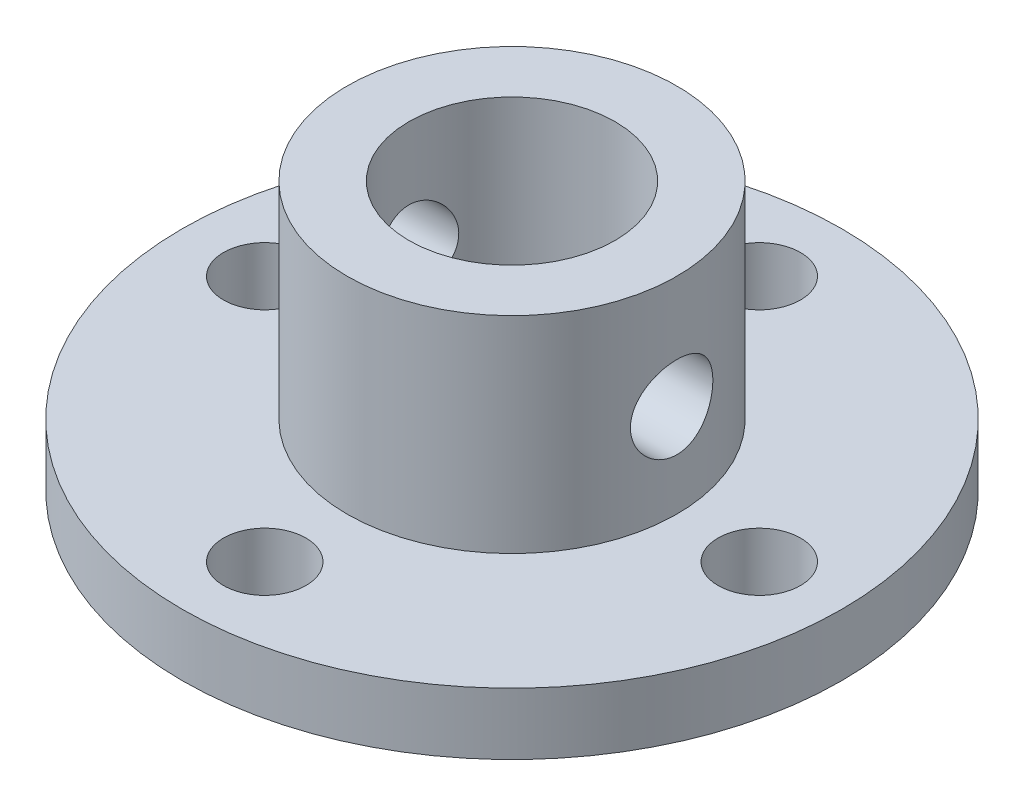
ISO-10303-21;
HEADER;
FILE_DESCRIPTION(('STEP AP214'),'2;1');
FILE_NAME('part.step','',(''),(''),'','','');
FILE_SCHEMA(('AUTOMOTIVE_DESIGN { 1 0 10303 214 1 1 1 1 }'));
ENDSEC;
DATA;
#1=APPLICATION_CONTEXT('core data for automotive mechanical design processes');
#2=APPLICATION_PROTOCOL_DEFINITION('international standard','automotive_design',2000,#1);
#3=PRODUCT_CONTEXT('',#1,'mechanical');
#4=PRODUCT('Part','Part','',(#3));
#5=PRODUCT_RELATED_PRODUCT_CATEGORY('part','',(#4));
#6=PRODUCT_DEFINITION_FORMATION('','',#4);
#7=PRODUCT_DEFINITION_CONTEXT('part definition',#1,'design');
#8=PRODUCT_DEFINITION('design','',#6,#7);
#9=PRODUCT_DEFINITION_SHAPE('','',#8);
#10=(LENGTH_UNIT() NAMED_UNIT(*) SI_UNIT(.MILLI.,.METRE.));
#11=(NAMED_UNIT(*) PLANE_ANGLE_UNIT() SI_UNIT($,.RADIAN.));
#12=(NAMED_UNIT(*) SI_UNIT($,.STERADIAN.) SOLID_ANGLE_UNIT());
#13=UNCERTAINTY_MEASURE_WITH_UNIT(LENGTH_MEASURE(1.E-05),#10,'distance_accuracy_value','');
#14=(GEOMETRIC_REPRESENTATION_CONTEXT(3) GLOBAL_UNCERTAINTY_ASSIGNED_CONTEXT((#13)) GLOBAL_UNIT_ASSIGNED_CONTEXT((#10,
#11,#12)) REPRESENTATION_CONTEXT('',''));
#15=CARTESIAN_POINT('',(0.,0.,0.));
#16=DIRECTION('',(0.,0.,1.));
#17=DIRECTION('',(1.,0.,0.));
#18=AXIS2_PLACEMENT_3D('',#15,#16,#17);
#19=CARTESIAN_POINT('',(0.,3.,0.));
#20=DIRECTION('',(0.,-1.,0.));
#21=DIRECTION('',(0.,0.,-1.));
#22=AXIS2_PLACEMENT_3D('',#19,#20,#21);
#23=CYLINDRICAL_SURFACE('',#22,5.);
#24=CARTESIAN_POINT('',(-4.58257569495584,7.5,2.));
#25=CARTESIAN_POINT('',(-4.58258022779737,7.60712368971296,1.99999540068022));
#26=CARTESIAN_POINT('',(-4.58638433797122,7.71442629433184,1.99134173553407));
#27=CARTESIAN_POINT('',(-4.601110833066,7.92593908409957,1.95706710874823));
#28=CARTESIAN_POINT('',(-4.61205140628347,8.03014065433852,1.93140279032341));
#29=CARTESIAN_POINT('',(-4.63960410719222,8.23205180897082,1.86423554476216));
#30=CARTESIAN_POINT('',(-4.65619484260882,8.32978424329122,1.82279228998551));
#31=CARTESIAN_POINT('',(-4.69314677188873,8.5168853548623,1.72542013194152));
#32=CARTESIAN_POINT('',(-4.71350714220611,8.60625585252411,1.66949439157707));
#33=CARTESIAN_POINT('',(-4.75700861562336,8.77926031454433,1.54132201423254));
#34=CARTESIAN_POINT('',(-4.78023917022606,8.86235639939724,1.46837936836551));
#35=CARTESIAN_POINT('',(-4.82612457915278,9.0155290208558,1.30970909513215));
#36=CARTESIAN_POINT('',(-4.84877922991761,9.08560100770971,1.22397701877347));
#37=CARTESIAN_POINT('',(-4.89203407641395,9.21340639030971,1.03800631337303));
#38=CARTESIAN_POINT('',(-4.9125180361257,9.27054429968594,0.937328966419093));
#39=CARTESIAN_POINT('',(-4.94803927702516,9.36684357017379,0.726825322068638));
#40=CARTESIAN_POINT('',(-4.96307877403249,9.40601224624887,0.617002769076883));
#41=CARTESIAN_POINT('',(-4.98538324990609,9.46334148599309,0.396966427039754));
#42=CARTESIAN_POINT('',(-4.99298936770628,9.48242731397022,0.287028984858317));
#43=CARTESIAN_POINT('',(-5.00080310687431,9.50202848578145,0.0652663285839626));
#44=CARTESIAN_POINT('',(-5.00101348770556,9.5025507559658,-0.0465581658394104));
#45=CARTESIAN_POINT('',(-4.99421962820612,9.4855172301958,-0.262232494702088));
#46=CARTESIAN_POINT('',(-4.98761996771485,9.46897522724528,-0.366177452870456));
#47=CARTESIAN_POINT('',(-4.96849291469141,9.42000712369703,-0.569673109221913));
#48=CARTESIAN_POINT('',(-4.95596508721342,9.38757985760154,-0.669223484391238));
#49=CARTESIAN_POINT('',(-4.92596824457467,9.30736351712174,-0.862897938510557));
#50=CARTESIAN_POINT('',(-4.90842760466223,9.25935028518462,-0.956917623378894));
#51=CARTESIAN_POINT('',(-4.87014585180275,9.14953499308084,-1.13580815074131));
#52=CARTESIAN_POINT('',(-4.84940364267149,9.08772820689983,-1.22067584271796));
#53=CARTESIAN_POINT('',(-4.80521637176122,8.94735086405612,-1.38476882799017));
#54=CARTESIAN_POINT('',(-4.78168326511759,8.8679461074272,-1.46325784526632));
#55=CARTESIAN_POINT('',(-4.73561660973263,8.697009428168,-1.60610741539265));
#56=CARTESIAN_POINT('',(-4.71308339008076,8.6054735518044,-1.67046334378698));
#57=CARTESIAN_POINT('',(-4.67096897409023,8.40958097762606,-1.78490418871927));
#58=CARTESIAN_POINT('',(-4.65148914057708,8.30493516966135,-1.83453465163626));
#59=CARTESIAN_POINT('',(-4.61887590344084,8.08778450968778,-1.91517625986646));
#60=CARTESIAN_POINT('',(-4.60573837891311,7.97528481527341,-1.94619949837798));
#61=CARTESIAN_POINT('',(-4.58829759702716,7.75296422253256,-1.9869549488549));
#62=CARTESIAN_POINT('',(-4.58350366456138,7.64339955287144,-1.99787209681454));
#63=CARTESIAN_POINT('',(-4.58189497869038,7.42392279224044,-2.00156132644289));
#64=CARTESIAN_POINT('',(-4.58507780560362,7.31401081672435,-1.99433891059128));
#65=CARTESIAN_POINT('',(-4.59856044359113,7.10354106504306,-1.96303289479003));
#66=CARTESIAN_POINT('',(-4.60844457798301,7.00280706259994,-1.93993306202386));
#67=CARTESIAN_POINT('',(-4.6337005102734,6.80671159521455,-1.87880418691087));
#68=CARTESIAN_POINT('',(-4.64907352488598,6.71135132689285,-1.84077183430228));
#69=CARTESIAN_POINT('',(-4.68433781860101,6.52439764220434,-1.74913563948157));
#70=CARTESIAN_POINT('',(-4.70438704639177,6.43311381130547,-1.69496286826465));
#71=CARTESIAN_POINT('',(-4.74650385157795,6.26051701255841,-1.57316522444182));
#72=CARTESIAN_POINT('',(-4.76857224896045,6.17920812720455,-1.50553487348189));
#73=CARTESIAN_POINT('',(-4.81420915971416,6.02262659140063,-1.35284421168058));
#74=CARTESIAN_POINT('',(-4.83776807285233,5.9482434347084,-1.26686542944544));
#75=CARTESIAN_POINT('',(-4.88219794567532,5.81482292339023,-1.08308363336851));
#76=CARTESIAN_POINT('',(-4.90306879593135,5.75578619340488,-0.985280138466608));
#77=CARTESIAN_POINT('',(-4.9398371590039,5.65495237353666,-0.780279934003015));
#78=CARTESIAN_POINT('',(-4.9557358624066,5.61315115582634,-0.673085480998745));
#79=CARTESIAN_POINT('',(-4.98072713468904,5.54845114760024,-0.452393590914548));
#80=CARTESIAN_POINT('',(-4.98982339706103,5.52554209858931,-0.33889961027682));
#81=CARTESIAN_POINT('',(-4.99979008211858,5.50049529834716,-0.116816510362615));
#82=CARTESIAN_POINT('',(-5.00115846749745,5.49709987143797,-0.00839049265208722));
#83=CARTESIAN_POINT('',(-4.99686042373721,5.50785547938346,0.207433835792265));
#84=CARTESIAN_POINT('',(-4.99119505948774,5.52200385815558,0.314832299614386));
#85=CARTESIAN_POINT('',(-4.97371513381836,5.56654678799988,0.522170901733397));
#86=CARTESIAN_POINT('',(-4.96209480698998,5.59642894475655,0.622238803864868));
#87=CARTESIAN_POINT('',(-4.93394947767358,5.67105280588107,0.815922355542602));
#88=CARTESIAN_POINT('',(-4.91742357062859,5.71579725093909,0.909536811189121));
#89=CARTESIAN_POINT('',(-4.88018094611867,5.82110319335323,1.09220303880515));
#90=CARTESIAN_POINT('',(-4.859311306872,5.88227627532513,1.18087037518738));
#91=CARTESIAN_POINT('',(-4.8158940222708,6.01778853874699,1.34705404014793));
#92=CARTESIAN_POINT('',(-4.79334568464253,6.09213316960822,1.42456572919735));
#93=CARTESIAN_POINT('',(-4.7473776736768,6.25731514684866,1.57120121894449));
#94=CARTESIAN_POINT('',(-4.72399047228096,6.3488885751441,1.63950871002775));
#95=CARTESIAN_POINT('',(-4.68049656850749,6.54294243572083,1.75984762763149));
#96=CARTESIAN_POINT('',(-4.66039025195448,6.64542414845354,1.81187714055767));
#97=CARTESIAN_POINT('',(-4.62758914239063,6.8490361864702,1.89399048451634));
#98=CARTESIAN_POINT('',(-4.61439096680415,6.94946160271244,1.92562535665267));
#99=CARTESIAN_POINT('',(-4.5944582603412,7.15448904149264,1.97271990928489));
#100=CARTESIAN_POINT('',(-4.58770572290435,7.25907857342435,1.98822466191608));
#101=CARTESIAN_POINT('',(-4.5839176394209,7.38677823911152,1.99692202185513));
#102=CARTESIAN_POINT('',(-4.58341531117284,7.40940148035643,1.99807530751895));
#103=CARTESIAN_POINT('',(-4.58274384722723,7.45468047679722,1.9996148112425));
#104=CARTESIAN_POINT('',(-4.5825747359592,7.47733623425516,2.0000009730612));
#105=CARTESIAN_POINT('',(-4.58257569495584,7.5,2.));
#106=B_SPLINE_CURVE_WITH_KNOTS('',3,(#24,#25,#26,#27,#28,#29,#30,#31,#32,#33,#34,#35,#36,#37,
#38,#39,#40,#41,#42,#43,#44,#45,#46,#47,#48,#49,#50,#51,#52,#53,#54,#55,#56,#57,#58,#59,#60,#61,
#62,#63,#64,#65,#66,#67,#68,#69,#70,#71,#72,#73,#74,#75,#76,#77,#78,#79,#80,#81,#82,#83,#84,#85,
#86,#87,#88,#89,#90,#91,#92,#93,#94,#95,#96,#97,#98,#99,#100,#101,#102,#103,#104,#105),
.UNSPECIFIED.,.T.,.F.,(4,2,2,2,2,2,2,2,2,2,2,2,2,2,2,2,2,2,2,2,2,2,2,2,2,2,2,2,2,2,2,2,2,2,2,2,
2,2,2,2,4),(0.,0.321277648767654,0.643377335822245,0.96427082329339,1.28509428823861,
1.62255618284425,1.96013574348342,2.31102669091428,2.6617746696948,2.99554182887183,
3.32918445305672,3.64408644830302,3.95901155129059,4.27868300234898,4.59846414940031,
4.93924044081356,5.28012807127127,5.63064458717257,5.98093304800101,6.30982147524421,
6.63861014907939,6.94867248085145,7.25880358651638,7.58151154652701,7.90435114525849,
8.25103734246979,8.59773764852748,8.94435487312812,9.29078375954136,9.61461039755953,
9.93838801512602,10.2522199444335,10.5661097782859,10.8938705113992,11.2217671656421,
11.5699625328561,11.9181988175919,12.2351666081908,12.5512463021924,12.619212852096,
12.6871843847255),.UNSPECIFIED.);
#107=CARTESIAN_POINT('',(-4.58257569495584,7.5,2.));
#108=VERTEX_POINT('',#107);
#109=EDGE_CURVE('E90',#108,#108,#106,.T.);
#110=ORIENTED_EDGE('',*,*,#109,.T.);
#111=EDGE_LOOP('',(#110));
#112=FACE_BOUND('',#111,.T.);
#113=CARTESIAN_POINT('',(0.,0.,0.));
#114=DIRECTION('',(0.,1.,0.));
#115=DIRECTION('',(0.,0.,1.));
#116=AXIS2_PLACEMENT_3D('',#113,#114,#115);
#117=CIRCLE('',#116,5.);
#118=CARTESIAN_POINT('',(0.,0.,5.));
#119=VERTEX_POINT('',#118);
#120=EDGE_CURVE('E151',#119,#119,#117,.T.);
#121=ORIENTED_EDGE('',*,*,#120,.F.);
#122=EDGE_LOOP('',(#121));
#123=FACE_BOUND('',#122,.T.);
#124=CARTESIAN_POINT('',(0.,13.,0.));
#125=DIRECTION('',(0.,1.,0.));
#126=DIRECTION('',(0.,0.,1.));
#127=AXIS2_PLACEMENT_3D('',#124,#125,#126);
#128=CIRCLE('',#127,5.);
#129=CARTESIAN_POINT('',(0.,13.,5.));
#130=VERTEX_POINT('',#129);
#131=EDGE_CURVE('E194',#130,#130,#128,.T.);
#132=ORIENTED_EDGE('',*,*,#131,.T.);
#133=EDGE_LOOP('',(#132));
#134=FACE_BOUND('',#133,.T.);
#135=CARTESIAN_POINT('',(4.58257569495584,7.5,2.));
#136=CARTESIAN_POINT('',(4.58258022779737,7.39287631028704,1.99999540068022));
#137=CARTESIAN_POINT('',(4.58638433797122,7.28557370566816,1.99134173553407));
#138=CARTESIAN_POINT('',(4.601110833066,7.07406091590043,1.95706710874823));
#139=CARTESIAN_POINT('',(4.61205140628347,6.96985934566148,1.93140279032341));
#140=CARTESIAN_POINT('',(4.63960410719222,6.76794819102917,1.86423554476216));
#141=CARTESIAN_POINT('',(4.65619484260882,6.67021575670878,1.82279228998551));
#142=CARTESIAN_POINT('',(4.69314677188873,6.4831146451377,1.72542013194152));
#143=CARTESIAN_POINT('',(4.71350714220611,6.39374414747589,1.66949439157707));
#144=CARTESIAN_POINT('',(4.75700861562336,6.22073968545567,1.54132201423254));
#145=CARTESIAN_POINT('',(4.78023917022606,6.13764360060276,1.46837936836551));
#146=CARTESIAN_POINT('',(4.82612457915278,5.9844709791442,1.30970909513215));
#147=CARTESIAN_POINT('',(4.84877922991761,5.9143989922903,1.22397701877347));
#148=CARTESIAN_POINT('',(4.89203407641395,5.78659360969029,1.03800631337303));
#149=CARTESIAN_POINT('',(4.9125180361257,5.72945570031406,0.937328966419093));
#150=CARTESIAN_POINT('',(4.94803927702516,5.63315642982621,0.726825322068638));
#151=CARTESIAN_POINT('',(4.96307877403249,5.59398775375113,0.617002769076883));
#152=CARTESIAN_POINT('',(4.98538324990609,5.53665851400691,0.396966427039753));
#153=CARTESIAN_POINT('',(4.99298936770628,5.51757268602978,0.287028984858316));
#154=CARTESIAN_POINT('',(5.00080310687431,5.49797151421855,0.0652663285839616));
#155=CARTESIAN_POINT('',(5.00101348770556,5.4974492440342,-0.0465581658394117));
#156=CARTESIAN_POINT('',(4.99421962820612,5.5144827698042,-0.262232494702089));
#157=CARTESIAN_POINT('',(4.98761996771485,5.53102477275471,-0.366177452870457));
#158=CARTESIAN_POINT('',(4.96849291469141,5.57999287630297,-0.569673109221914));
#159=CARTESIAN_POINT('',(4.95596508721342,5.61242014239846,-0.669223484391239));
#160=CARTESIAN_POINT('',(4.92596824457467,5.69263648287826,-0.862897938510558));
#161=CARTESIAN_POINT('',(4.90842760466223,5.74064971481538,-0.956917623378896));
#162=CARTESIAN_POINT('',(4.87014585180275,5.85046500691916,-1.13580815074131));
#163=CARTESIAN_POINT('',(4.84940364267149,5.91227179310017,-1.22067584271796));
#164=CARTESIAN_POINT('',(4.80521637176122,6.05264913594388,-1.38476882799018));
#165=CARTESIAN_POINT('',(4.78168326511759,6.1320538925728,-1.46325784526632));
#166=CARTESIAN_POINT('',(4.73561660973263,6.302990571832,-1.60610741539265));
#167=CARTESIAN_POINT('',(4.71308339008076,6.39452644819561,-1.67046334378698));
#168=CARTESIAN_POINT('',(4.67096897409023,6.59041902237394,-1.78490418871927));
#169=CARTESIAN_POINT('',(4.65148914057708,6.69506483033865,-1.83453465163626));
#170=CARTESIAN_POINT('',(4.61887590344084,6.91221549031222,-1.91517625986646));
#171=CARTESIAN_POINT('',(4.60573837891311,7.02471518472659,-1.94619949837798));
#172=CARTESIAN_POINT('',(4.58829759702716,7.24703577746744,-1.9869549488549));
#173=CARTESIAN_POINT('',(4.58350366456138,7.35660044712856,-1.99787209681454));
#174=CARTESIAN_POINT('',(4.58189497869038,7.57607720775956,-2.00156132644289));
#175=CARTESIAN_POINT('',(4.58507780560362,7.68598918327566,-1.99433891059128));
#176=CARTESIAN_POINT('',(4.59856044359114,7.89645893495694,-1.96303289479003));
#177=CARTESIAN_POINT('',(4.60844457798302,7.99719293740006,-1.93993306202386));
#178=CARTESIAN_POINT('',(4.6337005102734,8.19328840478546,-1.87880418691087));
#179=CARTESIAN_POINT('',(4.64907352488598,8.28864867310715,-1.84077183430228));
#180=CARTESIAN_POINT('',(4.68433781860101,8.47560235779566,-1.74913563948157));
#181=CARTESIAN_POINT('',(4.70438704639177,8.56688618869454,-1.69496286826465));
#182=CARTESIAN_POINT('',(4.74650385157795,8.73948298744159,-1.57316522444182));
#183=CARTESIAN_POINT('',(4.76857224896045,8.82079187279545,-1.50553487348189));
#184=CARTESIAN_POINT('',(4.81420915971416,8.97737340859937,-1.35284421168058));
#185=CARTESIAN_POINT('',(4.83776807285233,9.0517565652916,-1.26686542944543));
#186=CARTESIAN_POINT('',(4.88219794567532,9.18517707660977,-1.0830836333685));
#187=CARTESIAN_POINT('',(4.90306879593136,9.24421380659512,-0.985280138466607));
#188=CARTESIAN_POINT('',(4.9398371590039,9.34504762646334,-0.780279934003013));
#189=CARTESIAN_POINT('',(4.9557358624066,9.38684884417366,-0.673085480998743));
#190=CARTESIAN_POINT('',(4.98072713468904,9.45154885239976,-0.452393590914545));
#191=CARTESIAN_POINT('',(4.98982339706103,9.47445790141069,-0.338899610276817));
#192=CARTESIAN_POINT('',(4.99979008211858,9.49950470165284,-0.116816510362613));
#193=CARTESIAN_POINT('',(5.00115846749745,9.50290012856203,-0.00839049265208431));
#194=CARTESIAN_POINT('',(4.99686042373721,9.49214452061653,0.207433835792268));
#195=CARTESIAN_POINT('',(4.99119505948774,9.47799614184442,0.314832299614389));
#196=CARTESIAN_POINT('',(4.97371513381836,9.43345321200012,0.522170901733398));
#197=CARTESIAN_POINT('',(4.96209480698998,9.40357105524345,0.62223880386487));
#198=CARTESIAN_POINT('',(4.93394947767358,9.32894719411893,0.815922355542604));
#199=CARTESIAN_POINT('',(4.91742357062859,9.28420274906091,0.909536811189123));
#200=CARTESIAN_POINT('',(4.88018094611867,9.17889680664677,1.09220303880515));
#201=CARTESIAN_POINT('',(4.859311306872,9.11772372467486,1.18087037518738));
#202=CARTESIAN_POINT('',(4.8158940222708,8.98221146125301,1.34705404014793));
#203=CARTESIAN_POINT('',(4.79334568464253,8.90786683039178,1.42456572919735));
#204=CARTESIAN_POINT('',(4.7473776736768,8.74268485315134,1.57120121894449));
#205=CARTESIAN_POINT('',(4.72399047228096,8.6511114248559,1.63950871002775));
#206=CARTESIAN_POINT('',(4.68049656850749,8.45705756427917,1.75984762763149));
#207=CARTESIAN_POINT('',(4.66039025195448,8.35457585154646,1.81187714055767));
#208=CARTESIAN_POINT('',(4.62758914239063,8.1509638135298,1.89399048451634));
#209=CARTESIAN_POINT('',(4.61439096680415,8.05053839728756,1.92562535665267));
#210=CARTESIAN_POINT('',(4.5944582603412,7.84551095850736,1.97271990928489));
#211=CARTESIAN_POINT('',(4.58770572290435,7.74092142657564,1.98822466191608));
#212=CARTESIAN_POINT('',(4.5839176394209,7.61322176088848,1.99692202185513));
#213=CARTESIAN_POINT('',(4.58341531117284,7.59059851964357,1.99807530751895));
#214=CARTESIAN_POINT('',(4.58274384722723,7.54531952320278,1.9996148112425));
#215=CARTESIAN_POINT('',(4.5825747359592,7.52266376574484,2.0000009730612));
#216=CARTESIAN_POINT('',(4.58257569495584,7.5,2.));
#217=B_SPLINE_CURVE_WITH_KNOTS('',3,(#135,#136,#137,#138,#139,#140,#141,#142,#143,#144,#145,
#146,#147,#148,#149,#150,#151,#152,#153,#154,#155,#156,#157,#158,#159,#160,#161,#162,#163,#164,
#165,#166,#167,#168,#169,#170,#171,#172,#173,#174,#175,#176,#177,#178,#179,#180,#181,#182,#183,
#184,#185,#186,#187,#188,#189,#190,#191,#192,#193,#194,#195,#196,#197,#198,#199,#200,#201,#202,
#203,#204,#205,#206,#207,#208,#209,#210,#211,#212,#213,#214,#215,#216),.UNSPECIFIED.,.T.,.F.,(4,
2,2,2,2,2,2,2,2,2,2,2,2,2,2,2,2,2,2,2,2,2,2,2,2,2,2,2,2,2,2,2,2,2,2,2,2,2,2,2,4),(0.,
0.321277648767654,0.643377335822245,0.96427082329339,1.28509428823861,1.62255618284425,
1.96013574348342,2.31102669091428,2.6617746696948,2.99554182887184,3.32918445305672,
3.64408644830302,3.9590115512906,4.27868300234898,4.59846414940031,4.93924044081356,
5.28012807127127,5.63064458717258,5.98093304800101,6.30982147524421,6.6386101490794,
6.94867248085145,7.25880358651638,7.58151154652701,7.90435114525849,8.2510373424698,
8.59773764852748,8.94435487312813,9.29078375954136,9.61461039755953,9.93838801512602,
10.2522199444335,10.5661097782859,10.8938705113993,11.2217671656421,11.5699625328561,
11.9181988175919,12.2351666081908,12.5512463021924,12.619212852096,12.6871843847255),.UNSPECIFIED.);
#218=CARTESIAN_POINT('',(4.58257569495584,7.5,2.));
#219=VERTEX_POINT('',#218);
#220=EDGE_CURVE('E96',#219,#219,#217,.T.);
#221=ORIENTED_EDGE('',*,*,#220,.T.);
#222=EDGE_LOOP('',(#221));
#223=FACE_BOUND('',#222,.T.);
#224=ADVANCED_FACE('F44',(#112,#123,#134,#223),#23,.F.);
#225=CARTESIAN_POINT('',(0.,13.,0.));
#226=DIRECTION('',(0.,-1.,0.));
#227=DIRECTION('',(0.,0.,-1.));
#228=AXIS2_PLACEMENT_3D('',#225,#226,#227);
#229=CYLINDRICAL_SURFACE('',#228,8.);
#230=CARTESIAN_POINT('',(0.,13.,0.));
#231=DIRECTION('',(0.,1.,0.));
#232=DIRECTION('',(0.,0.,1.));
#233=AXIS2_PLACEMENT_3D('',#230,#231,#232);
#234=CIRCLE('',#233,8.);
#235=CARTESIAN_POINT('',(0.,13.,8.));
#236=VERTEX_POINT('',#235);
#237=EDGE_CURVE('E154',#236,#236,#234,.T.);
#238=ORIENTED_EDGE('',*,*,#237,.F.);
#239=EDGE_LOOP('',(#238));
#240=FACE_BOUND('',#239,.T.);
#241=CARTESIAN_POINT('',(0.,3.,0.));
#242=DIRECTION('',(0.,1.,0.));
#243=DIRECTION('',(0.,0.,1.));
#244=AXIS2_PLACEMENT_3D('',#241,#242,#243);
#245=CIRCLE('',#244,8.);
#246=CARTESIAN_POINT('',(0.,3.,8.));
#247=VERTEX_POINT('',#246);
#248=EDGE_CURVE('E161',#247,#247,#245,.T.);
#249=ORIENTED_EDGE('',*,*,#248,.T.);
#250=EDGE_LOOP('',(#249));
#251=FACE_BOUND('',#250,.T.);
#252=CARTESIAN_POINT('',(-7.74596669241483,7.5,2.));
#253=CARTESIAN_POINT('',(-7.74596880070288,7.61044060074126,1.99999686287446));
#254=CARTESIAN_POINT('',(-7.74835444811678,7.72091591894282,1.99082099639812));
#255=CARTESIAN_POINT('',(-7.75761489594051,7.93869406253881,1.95441850037103));
#256=CARTESIAN_POINT('',(-7.76449230897304,8.04599500357455,1.92718136539368));
#257=CARTESIAN_POINT('',(-7.7819097967692,8.25424283054975,1.85559295970563));
#258=CARTESIAN_POINT('',(-7.79244514152366,8.35519772430857,1.81126378228359));
#259=CARTESIAN_POINT('',(-7.81598553623007,8.54824868203191,1.70681691300911));
#260=CARTESIAN_POINT('',(-7.82899069102791,8.64034436966417,1.64669855084855));
#261=CARTESIAN_POINT('',(-7.856325730845,8.81508931620977,1.5109667418495));
#262=CARTESIAN_POINT('',(-7.87067678098427,8.89751488028004,1.43506951016324));
#263=CARTESIAN_POINT('',(-7.89890300412235,9.04860911548827,1.27054565128053));
#264=CARTESIAN_POINT('',(-7.91277813253111,9.1172765004974,1.18191783534425));
#265=CARTESIAN_POINT('',(-7.93872332416466,9.23982037410502,0.992916160863164));
#266=CARTESIAN_POINT('',(-7.95076549920474,9.29347711052917,0.892395660956097));
#267=CARTESIAN_POINT('',(-7.97144649540787,9.38304771532247,0.683410547434211));
#268=CARTESIAN_POINT('',(-7.98008581867475,9.41896420153241,0.574947108633554));
#269=CARTESIAN_POINT('',(-7.99283807078544,9.47131826766287,0.355487007003331));
#270=CARTESIAN_POINT('',(-7.99703915075451,9.48813571546127,0.244586175639182));
#271=CARTESIAN_POINT('',(-8.00074875285838,9.50300670342044,0.0214630554102164));
#272=CARTESIAN_POINT('',(-8.00025796877363,9.50106301776768,-0.0907590356304541));
#273=CARTESIAN_POINT('',(-7.99470475962828,9.47874011979988,-0.310704494344773));
#274=CARTESIAN_POINT('',(-7.98974401872699,9.45877093995691,-0.418472431202132));
#275=CARTESIAN_POINT('',(-7.97592669219883,9.4016229839612,-0.629076494827371));
#276=CARTESIAN_POINT('',(-7.96706989918753,9.36444329169807,-0.731912358740875));
#277=CARTESIAN_POINT('',(-7.94630007760717,9.27359794345035,-0.930813407003612));
#278=CARTESIAN_POINT('',(-7.93436015756043,9.2197863642706,-1.02680901953301));
#279=CARTESIAN_POINT('',(-7.90871923047719,9.09731545670699,-1.20855124468098));
#280=CARTESIAN_POINT('',(-7.89501791721992,9.0286535451515,-1.29429607017101));
#281=CARTESIAN_POINT('',(-7.86690971015616,8.8762330064141,-1.45554807016991));
#282=CARTESIAN_POINT('',(-7.85249375620734,8.79211608612178,-1.5307153581504));
#283=CARTESIAN_POINT('',(-7.82492034813365,8.6123200211678,-1.66595275192604));
#284=CARTESIAN_POINT('',(-7.81176295284776,8.5166403364072,-1.72602215209203));
#285=CARTESIAN_POINT('',(-7.78816397465319,8.31576797268083,-1.82957625804519));
#286=CARTESIAN_POINT('',(-7.77773586980577,8.21053141574945,-1.87297913394098));
#287=CARTESIAN_POINT('',(-7.76094912111966,7.99393162553884,-1.94137124127268));
#288=CARTESIAN_POINT('',(-7.75458960648175,7.88256970881349,-1.96636441310582));
#289=CARTESIAN_POINT('',(-7.74684284831312,7.6600323987815,-1.99666371093214));
#290=CARTESIAN_POINT('',(-7.74532871274918,7.5489297653363,-2.0024723791357));
#291=CARTESIAN_POINT('',(-7.74709874784831,7.32734245073747,-1.99561359241244));
#292=CARTESIAN_POINT('',(-7.75038247681013,7.21685771363901,-1.98294783827904));
#293=CARTESIAN_POINT('',(-7.76125665563648,7.00150858803624,-1.93994037115013));
#294=CARTESIAN_POINT('',(-7.768775761875,6.89658181874333,-1.9098912546254));
#295=CARTESIAN_POINT('',(-7.7872057461677,6.69325483371865,-1.8332944653365));
#296=CARTESIAN_POINT('',(-7.79811702598891,6.59485539275573,-1.78674483817004));
#297=CARTESIAN_POINT('',(-7.8223690967461,6.40524697770612,-1.67741653434925));
#298=CARTESIAN_POINT('',(-7.83575334885313,6.31421692796552,-1.6143374030685));
#299=CARTESIAN_POINT('',(-7.86333666457373,6.14384930975892,-1.47412058586891));
#300=CARTESIAN_POINT('',(-7.87753586182776,6.06451366667994,-1.39698058961088));
#301=CARTESIAN_POINT('',(-7.90557922425285,5.91775116594324,-1.22852544196945));
#302=CARTESIAN_POINT('',(-7.91940561649468,5.85067194996095,-1.13690390506319));
#303=CARTESIAN_POINT('',(-7.94477773290987,5.73285130643901,-0.943405365389351));
#304=CARTESIAN_POINT('',(-7.95632357603169,5.68210902671344,-0.841528897915183));
#305=CARTESIAN_POINT('',(-7.9757609259065,5.59884317237765,-0.631116403462182));
#306=CARTESIAN_POINT('',(-7.98367864017925,5.56618857249675,-0.522634762055765));
#307=CARTESIAN_POINT('',(-7.99508234716634,5.51963173231327,-0.301499520637615));
#308=CARTESIAN_POINT('',(-7.99856919514738,5.50572587300877,-0.188846730082482));
#309=CARTESIAN_POINT('',(-8.00068338817612,5.49726482084892,0.0341670528866451));
#310=CARTESIAN_POINT('',(-7.99943957759977,5.50219658180918,0.144507653932042));
#311=CARTESIAN_POINT('',(-7.99251792914887,5.5300956545887,0.3627349928295));
#312=CARTESIAN_POINT('',(-7.98684022314338,5.55306243002634,0.470621803561856));
#313=CARTESIAN_POINT('',(-7.97170865707778,5.61610443954172,0.680342071289547));
#314=CARTESIAN_POINT('',(-7.96227529004785,5.65608690662876,0.782204989161725));
#315=CARTESIAN_POINT('',(-7.94062577827316,5.75194115803914,0.977834106083248));
#316=CARTESIAN_POINT('',(-7.92840928277515,5.80781494534097,1.07159928253127));
#317=CARTESIAN_POINT('',(-7.90214499360574,5.93543046799226,1.25080385684661));
#318=CARTESIAN_POINT('',(-7.88806033883329,6.00752028580766,1.33598997659667));
#319=CARTESIAN_POINT('',(-7.85981298114379,6.16484570395469,1.49323004054701));
#320=CARTESIAN_POINT('',(-7.84565025934604,6.25008463222232,1.56528065015318));
#321=CARTESIAN_POINT('',(-7.81854951691005,6.43320282837892,1.69552405294366));
#322=CARTESIAN_POINT('',(-7.80563927346578,6.53128824673051,1.75343323883276));
#323=CARTESIAN_POINT('',(-7.78287910989656,6.73611097974964,1.85185379317094));
#324=CARTESIAN_POINT('',(-7.77302696466427,6.84284193218769,1.8923778195043));
#325=CARTESIAN_POINT('',(-7.75903817501475,7.04115402367032,1.948845057142));
#326=CARTESIAN_POINT('',(-7.75417326006998,7.13178632877227,1.96798634119376));
#327=CARTESIAN_POINT('',(-7.7476367716524,7.31493773799538,1.99356458514354));
#328=CARTESIAN_POINT('',(-7.74596492578215,7.4074566804888,2.0000026287435));
#329=CARTESIAN_POINT('',(-7.74596669241483,7.5,2.));
#330=B_SPLINE_CURVE_WITH_KNOTS('',3,(#252,#253,#254,#255,#256,#257,#258,#259,#260,#261,#262,
#263,#264,#265,#266,#267,#268,#269,#270,#271,#272,#273,#274,#275,#276,#277,#278,#279,#280,#281,
#282,#283,#284,#285,#286,#287,#288,#289,#290,#291,#292,#293,#294,#295,#296,#297,#298,#299,#300,
#301,#302,#303,#304,#305,#306,#307,#308,#309,#310,#311,#312,#313,#314,#315,#316,#317,#318,#319,
#320,#321,#322,#323,#324,#325,#326,#327,#328,#329),.UNSPECIFIED.,.T.,.F.,(4,2,2,2,2,2,2,2,2,2,2,
2,2,2,2,2,2,2,2,2,2,2,2,2,2,2,2,2,2,2,2,2,2,2,2,2,2,2,4),(0.,0.330981953388908,
0.662156593142932,0.992904581732817,1.32366661404383,1.66099163354381,1.99834817183893,
2.34041197118336,2.68242527877674,3.01751000796277,3.35254518932816,3.68014610151157,
4.00776445379829,4.33834299403555,4.6689790837513,5.00856373257529,5.34816424959841,
5.68941145606722,6.03058560103638,6.36274859809374,6.69488101747042,7.02157924007365,
7.34831617137134,7.68146276687326,8.01466415108036,8.35620264772255,8.69772332575643,
9.03673658245543,9.3756843912723,9.70546756901965,10.0352409390158,10.3632390124777,
10.6912784459046,11.0271767726566,11.3631602525241,11.7054118182895,12.0474137709606,
12.3247826174462,12.6021278008238),.UNSPECIFIED.);
#331=CARTESIAN_POINT('',(-7.74596669241483,7.5,2.));
#332=VERTEX_POINT('',#331);
#333=EDGE_CURVE('E69',#332,#332,#330,.T.);
#334=ORIENTED_EDGE('',*,*,#333,.F.);
#335=EDGE_LOOP('',(#334));
#336=FACE_BOUND('',#335,.T.);
#337=CARTESIAN_POINT('',(7.74596669241483,7.5,2.));
#338=CARTESIAN_POINT('',(7.74596880070288,7.38955939925874,1.99999686287446));
#339=CARTESIAN_POINT('',(7.74835444811678,7.27908408105718,1.99082099639812));
#340=CARTESIAN_POINT('',(7.75761489594051,7.06130593746119,1.95441850037103));
#341=CARTESIAN_POINT('',(7.76449230897304,6.95400499642545,1.92718136539368));
#342=CARTESIAN_POINT('',(7.7819097967692,6.74575716945025,1.85559295970563));
#343=CARTESIAN_POINT('',(7.79244514152366,6.64480227569143,1.81126378228359));
#344=CARTESIAN_POINT('',(7.81598553623007,6.45175131796809,1.70681691300911));
#345=CARTESIAN_POINT('',(7.82899069102791,6.35965563033583,1.64669855084855));
#346=CARTESIAN_POINT('',(7.856325730845,6.18491068379023,1.51096674184951));
#347=CARTESIAN_POINT('',(7.87067678098427,6.10248511971996,1.43506951016324));
#348=CARTESIAN_POINT('',(7.89890300412235,5.95139088451173,1.27054565128053));
#349=CARTESIAN_POINT('',(7.91277813253111,5.8827234995026,1.18191783534425));
#350=CARTESIAN_POINT('',(7.93872332416466,5.76017962589498,0.992916160863165));
#351=CARTESIAN_POINT('',(7.95076549920474,5.70652288947083,0.892395660956097));
#352=CARTESIAN_POINT('',(7.97144649540787,5.61695228467753,0.683410547434211));
#353=CARTESIAN_POINT('',(7.98008581867475,5.58103579846759,0.574947108633553));
#354=CARTESIAN_POINT('',(7.99283807078544,5.52868173233713,0.355487007003329));
#355=CARTESIAN_POINT('',(7.99703915075451,5.51186428453873,0.24458617563918));
#356=CARTESIAN_POINT('',(8.00074875285838,5.49699329657956,0.0214630554102154));
#357=CARTESIAN_POINT('',(8.00025796877363,5.49893698223232,-0.0907590356304549));
#358=CARTESIAN_POINT('',(7.99470475962828,5.52125988020012,-0.310704494344775));
#359=CARTESIAN_POINT('',(7.98974401872699,5.54122906004308,-0.418472431202134));
#360=CARTESIAN_POINT('',(7.97592669219883,5.5983770160388,-0.629076494827373));
#361=CARTESIAN_POINT('',(7.96706989918753,5.63555670830193,-0.731912358740876));
#362=CARTESIAN_POINT('',(7.94630007760717,5.72640205654965,-0.930813407003613));
#363=CARTESIAN_POINT('',(7.93436015756043,5.7802136357294,-1.02680901953301));
#364=CARTESIAN_POINT('',(7.90871923047719,5.90268454329301,-1.20855124468098));
#365=CARTESIAN_POINT('',(7.89501791721992,5.9713464548485,-1.29429607017101));
#366=CARTESIAN_POINT('',(7.86690971015616,6.1237669935859,-1.45554807016991));
#367=CARTESIAN_POINT('',(7.85249375620734,6.20788391387822,-1.5307153581504));
#368=CARTESIAN_POINT('',(7.82492034813365,6.3876799788322,-1.66595275192604));
#369=CARTESIAN_POINT('',(7.81176295284776,6.4833596635928,-1.72602215209203));
#370=CARTESIAN_POINT('',(7.78816397465319,6.68423202731917,-1.8295762580452));
#371=CARTESIAN_POINT('',(7.77773586980577,6.78946858425056,-1.87297913394098));
#372=CARTESIAN_POINT('',(7.76094912111966,7.00606837446116,-1.94137124127268));
#373=CARTESIAN_POINT('',(7.75458960648175,7.11743029118651,-1.96636441310582));
#374=CARTESIAN_POINT('',(7.74684284831313,7.3399676012185,-1.99666371093214));
#375=CARTESIAN_POINT('',(7.74532871274919,7.4510702346637,-2.0024723791357));
#376=CARTESIAN_POINT('',(7.74709874784831,7.67265754926253,-1.99561359241244));
#377=CARTESIAN_POINT('',(7.75038247681013,7.78314228636099,-1.98294783827904));
#378=CARTESIAN_POINT('',(7.76125665563648,7.99849141196376,-1.93994037115013));
#379=CARTESIAN_POINT('',(7.768775761875,8.10341818125668,-1.9098912546254));
#380=CARTESIAN_POINT('',(7.7872057461677,8.30674516628135,-1.8332944653365));
#381=CARTESIAN_POINT('',(7.79811702598891,8.40514460724427,-1.78674483817004));
#382=CARTESIAN_POINT('',(7.8223690967461,8.59475302229388,-1.67741653434925));
#383=CARTESIAN_POINT('',(7.83575334885313,8.68578307203448,-1.6143374030685));
#384=CARTESIAN_POINT('',(7.86333666457373,8.85615069024108,-1.47412058586891));
#385=CARTESIAN_POINT('',(7.87753586182776,8.93548633332006,-1.39698058961088));
#386=CARTESIAN_POINT('',(7.90557922425285,9.08224883405676,-1.22852544196945));
#387=CARTESIAN_POINT('',(7.91940561649468,9.14932805003905,-1.13690390506318));
#388=CARTESIAN_POINT('',(7.94477773290987,9.26714869356099,-0.94340536538935));
#389=CARTESIAN_POINT('',(7.95632357603169,9.31789097328656,-0.841528897915181));
#390=CARTESIAN_POINT('',(7.9757609259065,9.40115682762235,-0.631116403462181));
#391=CARTESIAN_POINT('',(7.98367864017925,9.43381142750325,-0.522634762055765));
#392=CARTESIAN_POINT('',(7.99508234716634,9.48036826768673,-0.301499520637615));
#393=CARTESIAN_POINT('',(7.99856919514738,9.49427412699123,-0.188846730082481));
#394=CARTESIAN_POINT('',(8.00068338817612,9.50273517915108,0.0341670528866464));
#395=CARTESIAN_POINT('',(7.99943957759977,9.49780341819082,0.144507653932044));
#396=CARTESIAN_POINT('',(7.99251792914887,9.4699043454113,0.362734992829502));
#397=CARTESIAN_POINT('',(7.98684022314338,9.44693756997366,0.470621803561857));
#398=CARTESIAN_POINT('',(7.97170865707778,9.38389556045828,0.680342071289548));
#399=CARTESIAN_POINT('',(7.96227529004785,9.34391309337124,0.782204989161725));
#400=CARTESIAN_POINT('',(7.94062577827316,9.24805884196086,0.977834106083247));
#401=CARTESIAN_POINT('',(7.92840928277515,9.19218505465903,1.07159928253127));
#402=CARTESIAN_POINT('',(7.90214499360574,9.06456953200773,1.25080385684661));
#403=CARTESIAN_POINT('',(7.88806033883329,8.99247971419234,1.33598997659667));
#404=CARTESIAN_POINT('',(7.85981298114379,8.83515429604531,1.49323004054701));
#405=CARTESIAN_POINT('',(7.84565025934604,8.74991536777767,1.56528065015318));
#406=CARTESIAN_POINT('',(7.81854951691005,8.56679717162108,1.69552405294366));
#407=CARTESIAN_POINT('',(7.80563927346578,8.46871175326949,1.75343323883276));
#408=CARTESIAN_POINT('',(7.78287910989656,8.26388902025036,1.85185379317094));
#409=CARTESIAN_POINT('',(7.77302696466428,8.15715806781231,1.8923778195043));
#410=CARTESIAN_POINT('',(7.75903817501475,7.95884597632968,1.948845057142));
#411=CARTESIAN_POINT('',(7.75417326006998,7.86821367122772,1.96798634119376));
#412=CARTESIAN_POINT('',(7.7476367716524,7.68506226200462,1.99356458514354));
#413=CARTESIAN_POINT('',(7.74596492578215,7.5925433195112,2.0000026287435));
#414=CARTESIAN_POINT('',(7.74596669241483,7.5,2.));
#415=B_SPLINE_CURVE_WITH_KNOTS('',3,(#337,#338,#339,#340,#341,#342,#343,#344,#345,#346,#347,
#348,#349,#350,#351,#352,#353,#354,#355,#356,#357,#358,#359,#360,#361,#362,#363,#364,#365,#366,
#367,#368,#369,#370,#371,#372,#373,#374,#375,#376,#377,#378,#379,#380,#381,#382,#383,#384,#385,
#386,#387,#388,#389,#390,#391,#392,#393,#394,#395,#396,#397,#398,#399,#400,#401,#402,#403,#404,
#405,#406,#407,#408,#409,#410,#411,#412,#413,#414),.UNSPECIFIED.,.T.,.F.,(4,2,2,2,2,2,2,2,2,2,2,
2,2,2,2,2,2,2,2,2,2,2,2,2,2,2,2,2,2,2,2,2,2,2,2,2,2,2,4),(0.,0.330981953388909,
0.662156593142932,0.992904581732817,1.32366661404383,1.66099163354381,1.99834817183893,
2.34041197118336,2.68242527877674,3.01751000796277,3.35254518932816,3.68014610151158,
4.00776445379829,4.33834299403556,4.66897908375131,5.00856373257529,5.34816424959842,
5.68941145606722,6.03058560103638,6.36274859809374,6.69488101747042,7.02157924007366,
7.34831617137134,7.68146276687326,8.01466415108036,8.35620264772255,8.69772332575643,
9.03673658245543,9.37568439127231,9.70546756901966,10.0352409390158,10.3632390124777,
10.6912784459046,11.0271767726566,11.3631602525241,11.7054118182895,12.0474137709606,
12.3247826174462,12.6021278008238),.UNSPECIFIED.);
#416=CARTESIAN_POINT('',(7.74596669241483,7.5,2.));
#417=VERTEX_POINT('',#416);
#418=EDGE_CURVE('E48',#417,#417,#415,.T.);
#419=ORIENTED_EDGE('',*,*,#418,.F.);
#420=EDGE_LOOP('',(#419));
#421=FACE_BOUND('',#420,.T.);
#422=ADVANCED_FACE('F75',(#240,#251,#336,#421),#229,.T.);
#423=CARTESIAN_POINT('',(0.,3.,0.));
#424=DIRECTION('',(0.,1.,0.));
#425=DIRECTION('',(0.,0.,1.));
#426=AXIS2_PLACEMENT_3D('',#423,#424,#425);
#427=PLANE('',#426);
#428=CARTESIAN_POINT('',(0.,3.,12.));
#429=DIRECTION('',(0.,1.,0.));
#430=DIRECTION('',(0.,0.,-1.));
#431=AXIS2_PLACEMENT_3D('',#428,#429,#430);
#432=CIRCLE('',#431,2.);
#433=CARTESIAN_POINT('',(0.,3.,10.));
#434=VERTEX_POINT('',#433);
#435=EDGE_CURVE('E168',#434,#434,#432,.T.);
#436=ORIENTED_EDGE('',*,*,#435,.F.);
#437=EDGE_LOOP('',(#436));
#438=FACE_BOUND('',#437,.T.);
#439=CARTESIAN_POINT('',(0.,3.,-12.));
#440=DIRECTION('',(0.,1.,0.));
#441=DIRECTION('',(0.,0.,1.));
#442=AXIS2_PLACEMENT_3D('',#439,#440,#441);
#443=CIRCLE('',#442,2.);
#444=CARTESIAN_POINT('',(0.,3.,-10.));
#445=VERTEX_POINT('',#444);
#446=EDGE_CURVE('E64',#445,#445,#443,.T.);
#447=ORIENTED_EDGE('',*,*,#446,.F.);
#448=EDGE_LOOP('',(#447));
#449=FACE_BOUND('',#448,.T.);
#450=CARTESIAN_POINT('',(0.,3.,0.));
#451=DIRECTION('',(0.,1.,0.));
#452=DIRECTION('',(0.,0.,1.));
#453=AXIS2_PLACEMENT_3D('',#450,#451,#452);
#454=CIRCLE('',#453,16.);
#455=CARTESIAN_POINT('',(0.,3.,16.));
#456=VERTEX_POINT('',#455);
#457=EDGE_CURVE('E10',#456,#456,#454,.T.);
#458=ORIENTED_EDGE('',*,*,#457,.T.);
#459=EDGE_LOOP('',(#458));
#460=FACE_BOUND('',#459,.T.);
#461=CARTESIAN_POINT('',(12.,3.,0.));
#462=DIRECTION('',(0.,1.,0.));
#463=DIRECTION('',(0.,0.,1.));
#464=AXIS2_PLACEMENT_3D('',#461,#462,#463);
#465=CIRCLE('',#464,2.);
#466=CARTESIAN_POINT('',(12.,3.,2.));
#467=VERTEX_POINT('',#466);
#468=EDGE_CURVE('E174',#467,#467,#465,.T.);
#469=ORIENTED_EDGE('',*,*,#468,.F.);
#470=EDGE_LOOP('',(#469));
#471=FACE_BOUND('',#470,.T.);
#472=CARTESIAN_POINT('',(-12.,3.,0.));
#473=DIRECTION('',(0.,1.,0.));
#474=DIRECTION('',(0.,0.,-1.));
#475=AXIS2_PLACEMENT_3D('',#472,#473,#474);
#476=CIRCLE('',#475,2.);
#477=CARTESIAN_POINT('',(-12.,3.,-2.));
#478=VERTEX_POINT('',#477);
#479=EDGE_CURVE('E158',#478,#478,#476,.T.);
#480=ORIENTED_EDGE('',*,*,#479,.F.);
#481=EDGE_LOOP('',(#480));
#482=FACE_BOUND('',#481,.T.);
#483=ORIENTED_EDGE('',*,*,#248,.F.);
#484=EDGE_LOOP('',(#483));
#485=FACE_BOUND('',#484,.T.);
#486=ADVANCED_FACE('F122',(#438,#449,#460,#471,#482,#485),#427,.T.);
#487=CARTESIAN_POINT('',(0.,0.,0.));
#488=DIRECTION('',(0.,1.,0.));
#489=DIRECTION('',(0.,0.,1.));
#490=AXIS2_PLACEMENT_3D('',#487,#488,#489);
#491=PLANE('',#490);
#492=CARTESIAN_POINT('',(0.,0.,0.));
#493=DIRECTION('',(0.,1.,0.));
#494=DIRECTION('',(0.,0.,1.));
#495=AXIS2_PLACEMENT_3D('',#492,#493,#494);
#496=CIRCLE('',#495,16.);
#497=CARTESIAN_POINT('',(0.,0.,16.));
#498=VERTEX_POINT('',#497);
#499=EDGE_CURVE('E58',#498,#498,#496,.T.);
#500=ORIENTED_EDGE('',*,*,#499,.F.);
#501=EDGE_LOOP('',(#500));
#502=FACE_BOUND('',#501,.T.);
#503=CARTESIAN_POINT('',(0.,0.,-12.));
#504=DIRECTION('',(0.,1.,0.));
#505=DIRECTION('',(0.,0.,1.));
#506=AXIS2_PLACEMENT_3D('',#503,#504,#505);
#507=CIRCLE('',#506,2.);
#508=CARTESIAN_POINT('',(0.,0.,-10.));
#509=VERTEX_POINT('',#508);
#510=EDGE_CURVE('E67',#509,#509,#507,.T.);
#511=ORIENTED_EDGE('',*,*,#510,.T.);
#512=EDGE_LOOP('',(#511));
#513=FACE_BOUND('',#512,.T.);
#514=CARTESIAN_POINT('',(12.,0.,0.));
#515=DIRECTION('',(0.,1.,0.));
#516=DIRECTION('',(0.,0.,1.));
#517=AXIS2_PLACEMENT_3D('',#514,#515,#516);
#518=CIRCLE('',#517,2.);
#519=CARTESIAN_POINT('',(12.,0.,2.));
#520=VERTEX_POINT('',#519);
#521=EDGE_CURVE('E140',#520,#520,#518,.T.);
#522=ORIENTED_EDGE('',*,*,#521,.T.);
#523=EDGE_LOOP('',(#522));
#524=FACE_BOUND('',#523,.T.);
#525=CARTESIAN_POINT('',(0.,0.,12.));
#526=DIRECTION('',(0.,1.,0.));
#527=DIRECTION('',(0.,0.,-1.));
#528=AXIS2_PLACEMENT_3D('',#525,#526,#527);
#529=CIRCLE('',#528,2.);
#530=CARTESIAN_POINT('',(0.,0.,10.));
#531=VERTEX_POINT('',#530);
#532=EDGE_CURVE('E144',#531,#531,#529,.T.);
#533=ORIENTED_EDGE('',*,*,#532,.T.);
#534=EDGE_LOOP('',(#533));
#535=FACE_BOUND('',#534,.T.);
#536=CARTESIAN_POINT('',(-12.,0.,0.));
#537=DIRECTION('',(0.,1.,0.));
#538=DIRECTION('',(0.,0.,-1.));
#539=AXIS2_PLACEMENT_3D('',#536,#537,#538);
#540=CIRCLE('',#539,2.);
#541=CARTESIAN_POINT('',(-12.,0.,-2.));
#542=VERTEX_POINT('',#541);
#543=EDGE_CURVE('E148',#542,#542,#540,.T.);
#544=ORIENTED_EDGE('',*,*,#543,.T.);
#545=EDGE_LOOP('',(#544));
#546=FACE_BOUND('',#545,.T.);
#547=ORIENTED_EDGE('',*,*,#120,.T.);
#548=EDGE_LOOP('',(#547));
#549=FACE_BOUND('',#548,.T.);
#550=ADVANCED_FACE('F124',(#502,#513,#524,#535,#546,#549),#491,.F.);
#551=CARTESIAN_POINT('',(0.,3.,0.));
#552=DIRECTION('',(0.,-1.,0.));
#553=DIRECTION('',(0.,0.,-1.));
#554=AXIS2_PLACEMENT_3D('',#551,#552,#553);
#555=CYLINDRICAL_SURFACE('',#554,16.);
#556=ORIENTED_EDGE('',*,*,#457,.F.);
#557=EDGE_LOOP('',(#556));
#558=FACE_BOUND('',#557,.T.);
#559=ORIENTED_EDGE('',*,*,#499,.T.);
#560=EDGE_LOOP('',(#559));
#561=FACE_BOUND('',#560,.T.);
#562=ADVANCED_FACE('F46',(#558,#561),#555,.T.);
#563=CARTESIAN_POINT('',(0.,3.,-12.));
#564=DIRECTION('',(0.,-1.,0.));
#565=DIRECTION('',(0.,0.,-1.));
#566=AXIS2_PLACEMENT_3D('',#563,#564,#565);
#567=CYLINDRICAL_SURFACE('',#566,2.);
#568=ORIENTED_EDGE('',*,*,#446,.T.);
#569=EDGE_LOOP('',(#568));
#570=FACE_BOUND('',#569,.T.);
#571=ORIENTED_EDGE('',*,*,#510,.F.);
#572=EDGE_LOOP('',(#571));
#573=FACE_BOUND('',#572,.T.);
#574=ADVANCED_FACE('F117',(#570,#573),#567,.F.);
#575=CARTESIAN_POINT('',(12.,3.,0.));
#576=DIRECTION('',(0.,-1.,0.));
#577=DIRECTION('',(0.,0.,-1.));
#578=AXIS2_PLACEMENT_3D('',#575,#576,#577);
#579=CYLINDRICAL_SURFACE('',#578,2.);
#580=ORIENTED_EDGE('',*,*,#468,.T.);
#581=EDGE_LOOP('',(#580));
#582=FACE_BOUND('',#581,.T.);
#583=ORIENTED_EDGE('',*,*,#521,.F.);
#584=EDGE_LOOP('',(#583));
#585=FACE_BOUND('',#584,.T.);
#586=ADVANCED_FACE('F113',(#582,#585),#579,.F.);
#587=CARTESIAN_POINT('',(0.,3.,12.));
#588=DIRECTION('',(0.,-1.,0.));
#589=DIRECTION('',(0.,0.,-1.));
#590=AXIS2_PLACEMENT_3D('',#587,#588,#589);
#591=CYLINDRICAL_SURFACE('',#590,2.);
#592=ORIENTED_EDGE('',*,*,#435,.T.);
#593=EDGE_LOOP('',(#592));
#594=FACE_BOUND('',#593,.T.);
#595=ORIENTED_EDGE('',*,*,#532,.F.);
#596=EDGE_LOOP('',(#595));
#597=FACE_BOUND('',#596,.T.);
#598=ADVANCED_FACE('F109',(#594,#597),#591,.F.);
#599=CARTESIAN_POINT('',(-12.,3.,0.));
#600=DIRECTION('',(0.,-1.,0.));
#601=DIRECTION('',(0.,0.,-1.));
#602=AXIS2_PLACEMENT_3D('',#599,#600,#601);
#603=CYLINDRICAL_SURFACE('',#602,2.);
#604=ORIENTED_EDGE('',*,*,#479,.T.);
#605=EDGE_LOOP('',(#604));
#606=FACE_BOUND('',#605,.T.);
#607=ORIENTED_EDGE('',*,*,#543,.F.);
#608=EDGE_LOOP('',(#607));
#609=FACE_BOUND('',#608,.T.);
#610=ADVANCED_FACE('F105',(#606,#609),#603,.F.);
#611=CARTESIAN_POINT('',(0.,13.,0.));
#612=DIRECTION('',(0.,1.,0.));
#613=DIRECTION('',(0.,0.,1.));
#614=AXIS2_PLACEMENT_3D('',#611,#612,#613);
#615=PLANE('',#614);
#616=ORIENTED_EDGE('',*,*,#237,.T.);
#617=EDGE_LOOP('',(#616));
#618=FACE_BOUND('',#617,.T.);
#619=ORIENTED_EDGE('',*,*,#131,.F.);
#620=EDGE_LOOP('',(#619));
#621=FACE_BOUND('',#620,.T.);
#622=ADVANCED_FACE('F84',(#618,#621),#615,.T.);
#623=CARTESIAN_POINT('',(10.,7.5,0.));
#624=DIRECTION('',(-1.,0.,0.));
#625=DIRECTION('',(0.,0.,1.));
#626=AXIS2_PLACEMENT_3D('',#623,#624,#625);
#627=CYLINDRICAL_SURFACE('',#626,2.);
#628=ORIENTED_EDGE('',*,*,#109,.F.);
#629=EDGE_LOOP('',(#628));
#630=FACE_BOUND('',#629,.T.);
#631=ORIENTED_EDGE('',*,*,#333,.T.);
#632=EDGE_LOOP('',(#631));
#633=FACE_BOUND('',#632,.T.);
#634=ADVANCED_FACE('F82',(#630,#633),#627,.F.);
#635=ORIENTED_EDGE('',*,*,#220,.F.);
#636=EDGE_LOOP('',(#635));
#637=FACE_BOUND('',#636,.T.);
#638=ORIENTED_EDGE('',*,*,#418,.T.);
#639=EDGE_LOOP('',(#638));
#640=FACE_BOUND('',#639,.T.);
#641=ADVANCED_FACE('F79',(#637,#640),#627,.F.);
#642=CLOSED_SHELL('',(#224,#422,#486,#550,#562,#574,#586,#598,#610,#622,#634,#641));
#643=MANIFOLD_SOLID_BREP('B2',#642);
#644=ADVANCED_BREP_SHAPE_REPRESENTATION('',(#18,#643),#14);
#645=SHAPE_DEFINITION_REPRESENTATION(#9,#644);
ENDSEC;
END-ISO-10303-21;
